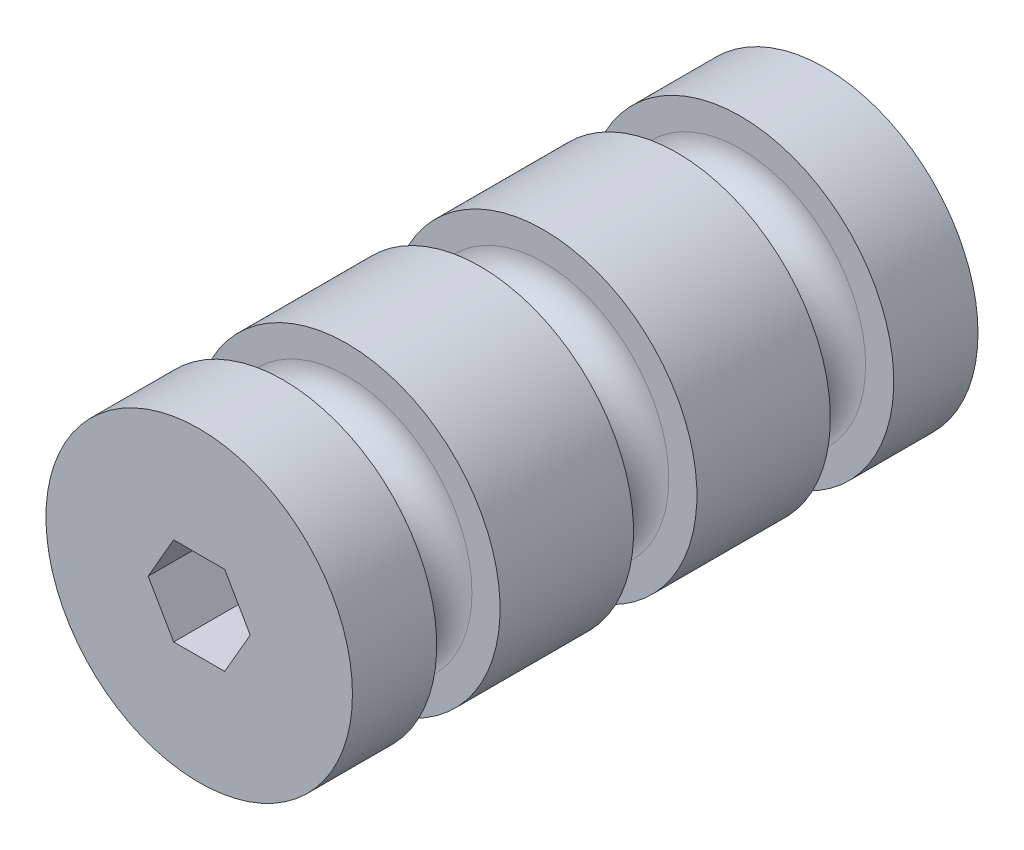
ISO-10303-21;
HEADER;
FILE_DESCRIPTION(('STEP AP214'),'2;1');
FILE_NAME('part.step','',(''),(''),'','','');
FILE_SCHEMA(('AUTOMOTIVE_DESIGN { 1 0 10303 214 1 1 1 1 }'));
ENDSEC;
DATA;
#1=APPLICATION_CONTEXT('core data for automotive mechanical design processes');
#2=APPLICATION_PROTOCOL_DEFINITION('international standard','automotive_design',2000,#1);
#3=PRODUCT_CONTEXT('',#1,'mechanical');
#4=PRODUCT('Part','Part','',(#3));
#5=PRODUCT_RELATED_PRODUCT_CATEGORY('part','',(#4));
#6=PRODUCT_DEFINITION_FORMATION('','',#4);
#7=PRODUCT_DEFINITION_CONTEXT('part definition',#1,'design');
#8=PRODUCT_DEFINITION('design','',#6,#7);
#9=PRODUCT_DEFINITION_SHAPE('','',#8);
#10=(LENGTH_UNIT() NAMED_UNIT(*) SI_UNIT(.MILLI.,.METRE.));
#11=(NAMED_UNIT(*) PLANE_ANGLE_UNIT() SI_UNIT($,.RADIAN.));
#12=(NAMED_UNIT(*) SI_UNIT($,.STERADIAN.) SOLID_ANGLE_UNIT());
#13=UNCERTAINTY_MEASURE_WITH_UNIT(LENGTH_MEASURE(1.E-05),#10,'distance_accuracy_value','');
#14=(GEOMETRIC_REPRESENTATION_CONTEXT(3) GLOBAL_UNCERTAINTY_ASSIGNED_CONTEXT((#13)) GLOBAL_UNIT_ASSIGNED_CONTEXT((#10,
#11,#12)) REPRESENTATION_CONTEXT('',''));
#15=CARTESIAN_POINT('',(0.,0.,0.));
#16=DIRECTION('',(0.,0.,1.));
#17=DIRECTION('',(1.,0.,0.));
#18=AXIS2_PLACEMENT_3D('',#15,#16,#17);
#19=CARTESIAN_POINT('',(0.,0.,95.25));
#20=DIRECTION('',(0.,0.,-1.));
#21=DIRECTION('',(-1.,0.,0.));
#22=AXIS2_PLACEMENT_3D('',#19,#20,#21);
#23=CYLINDRICAL_SURFACE('',#22,23.33625);
#24=CARTESIAN_POINT('',(0.,0.,12.827));
#25=DIRECTION('',(0.,0.,-1.));
#26=DIRECTION('',(0.,1.,0.));
#27=AXIS2_PLACEMENT_3D('',#24,#25,#26);
#28=CIRCLE('',#27,23.33625);
#29=CARTESIAN_POINT('',(0.,23.33625,12.827));
#30=VERTEX_POINT('',#29);
#31=EDGE_CURVE('E220',#30,#30,#28,.T.);
#32=ORIENTED_EDGE('',*,*,#31,.T.);
#33=EDGE_LOOP('',(#32));
#34=FACE_BOUND('',#33,.T.);
#35=CARTESIAN_POINT('',(0.,0.,0.));
#36=DIRECTION('',(0.,0.,1.));
#37=DIRECTION('',(1.,0.,0.));
#38=AXIS2_PLACEMENT_3D('',#35,#36,#37);
#39=CIRCLE('',#38,23.33625);
#40=CARTESIAN_POINT('',(23.33625,0.,0.));
#41=VERTEX_POINT('',#40);
#42=EDGE_CURVE('E43',#41,#41,#39,.T.);
#43=ORIENTED_EDGE('',*,*,#42,.T.);
#44=EDGE_LOOP('',(#43));
#45=FACE_BOUND('',#44,.T.);
#46=ADVANCED_FACE('F39',(#34,#45),#23,.T.);
#47=CARTESIAN_POINT('',(0.,0.,95.25));
#48=DIRECTION('',(0.,0.,1.));
#49=DIRECTION('',(1.,0.,0.));
#50=AXIS2_PLACEMENT_3D('',#47,#48,#49);
#51=PLANE('',#50);
#52=CARTESIAN_POINT('',(0.,0.,95.25));
#53=DIRECTION('',(0.,0.,1.));
#54=DIRECTION('',(1.,0.,0.));
#55=AXIS2_PLACEMENT_3D('',#52,#53,#54);
#56=CIRCLE('',#55,23.33625);
#57=CARTESIAN_POINT('',(23.33625,0.,95.25));
#58=VERTEX_POINT('',#57);
#59=EDGE_CURVE('E11',#58,#58,#56,.T.);
#60=ORIENTED_EDGE('',*,*,#59,.T.);
#61=EDGE_LOOP('',(#60));
#62=FACE_BOUND('',#61,.T.);
#63=DIRECTION('',(0.5,-0.866025403784439,0.));
#64=VECTOR('',#63,1.);
#65=CARTESIAN_POINT('',(-3.88614466191538,-6.73100000000001,95.25));
#66=LINE('',#65,#64);
#67=CARTESIAN_POINT('',(-7.77228932383075,0.,95.25));
#68=VERTEX_POINT('',#67);
#69=CARTESIAN_POINT('',(-3.88614466191538,-6.73100000000001,95.25));
#70=VERTEX_POINT('',#69);
#71=EDGE_CURVE('E102',#68,#70,#66,.T.);
#72=ORIENTED_EDGE('',*,*,#71,.F.);
#73=DIRECTION('',(-0.500000000000001,-0.866025403784438,0.));
#74=VECTOR('',#73,1.);
#75=CARTESIAN_POINT('',(-7.77228932383075,0.,95.25));
#76=LINE('',#75,#74);
#77=CARTESIAN_POINT('',(-3.88614466191537,6.73100000000001,95.25));
#78=VERTEX_POINT('',#77);
#79=EDGE_CURVE('E93',#78,#68,#76,.T.);
#80=ORIENTED_EDGE('',*,*,#79,.F.);
#81=DIRECTION('',(-1.,0.,0.));
#82=VECTOR('',#81,1.);
#83=CARTESIAN_POINT('',(-3.88614466191537,6.73100000000001,95.25));
#84=LINE('',#83,#82);
#85=CARTESIAN_POINT('',(3.88614466191538,6.73100000000001,95.25));
#86=VERTEX_POINT('',#85);
#87=EDGE_CURVE('E129',#86,#78,#84,.T.);
#88=ORIENTED_EDGE('',*,*,#87,.F.);
#89=DIRECTION('',(-0.5,0.866025403784439,0.));
#90=VECTOR('',#89,1.);
#91=CARTESIAN_POINT('',(3.88614466191538,6.73100000000001,95.25));
#92=LINE('',#91,#90);
#93=CARTESIAN_POINT('',(7.77228932383075,0.,95.25));
#94=VERTEX_POINT('',#93);
#95=EDGE_CURVE('E126',#94,#86,#92,.T.);
#96=ORIENTED_EDGE('',*,*,#95,.F.);
#97=DIRECTION('',(0.5,0.866025403784438,0.));
#98=VECTOR('',#97,1.);
#99=CARTESIAN_POINT('',(7.77228932383075,0.,95.25));
#100=LINE('',#99,#98);
#101=CARTESIAN_POINT('',(3.88614466191537,-6.73100000000001,95.25));
#102=VERTEX_POINT('',#101);
#103=EDGE_CURVE('E120',#102,#94,#100,.T.);
#104=ORIENTED_EDGE('',*,*,#103,.F.);
#105=DIRECTION('',(1.,0.,0.));
#106=VECTOR('',#105,1.);
#107=CARTESIAN_POINT('',(3.88614466191537,-6.73100000000001,95.25));
#108=LINE('',#107,#106);
#109=EDGE_CURVE('E116',#70,#102,#108,.T.);
#110=ORIENTED_EDGE('',*,*,#109,.F.);
#111=EDGE_LOOP('',(#72,#80,#88,#96,#104,#110));
#112=FACE_BOUND('',#111,.T.);
#113=ADVANCED_FACE('F114',(#62,#112),#51,.T.);
#114=CARTESIAN_POINT('',(0.,0.,0.));
#115=DIRECTION('',(0.,0.,1.));
#116=DIRECTION('',(1.,0.,0.));
#117=AXIS2_PLACEMENT_3D('',#114,#115,#116);
#118=PLANE('',#117);
#119=ORIENTED_EDGE('',*,*,#42,.F.);
#120=EDGE_LOOP('',(#119));
#121=FACE_BOUND('',#120,.T.);
#122=DIRECTION('',(-0.500000000000001,-0.866025403784438,0.));
#123=VECTOR('',#122,1.);
#124=CARTESIAN_POINT('',(-7.77228932383075,0.,0.));
#125=LINE('',#124,#123);
#126=CARTESIAN_POINT('',(-3.88614466191537,6.73100000000001,0.));
#127=VERTEX_POINT('',#126);
#128=CARTESIAN_POINT('',(-7.77228932383075,0.,0.));
#129=VERTEX_POINT('',#128);
#130=EDGE_CURVE('E63',#127,#129,#125,.T.);
#131=ORIENTED_EDGE('',*,*,#130,.T.);
#132=DIRECTION('',(0.5,-0.866025403784439,0.));
#133=VECTOR('',#132,1.);
#134=CARTESIAN_POINT('',(-3.88614466191538,-6.73100000000001,0.));
#135=LINE('',#134,#133);
#136=CARTESIAN_POINT('',(-3.88614466191538,-6.73100000000001,0.));
#137=VERTEX_POINT('',#136);
#138=EDGE_CURVE('E109',#129,#137,#135,.T.);
#139=ORIENTED_EDGE('',*,*,#138,.T.);
#140=DIRECTION('',(1.,0.,0.));
#141=VECTOR('',#140,1.);
#142=CARTESIAN_POINT('',(3.88614466191537,-6.73100000000001,0.));
#143=LINE('',#142,#141);
#144=CARTESIAN_POINT('',(3.88614466191537,-6.73100000000001,0.));
#145=VERTEX_POINT('',#144);
#146=EDGE_CURVE('E137',#137,#145,#143,.T.);
#147=ORIENTED_EDGE('',*,*,#146,.T.);
#148=DIRECTION('',(0.5,0.866025403784438,0.));
#149=VECTOR('',#148,1.);
#150=CARTESIAN_POINT('',(7.77228932383075,0.,0.));
#151=LINE('',#150,#149);
#152=CARTESIAN_POINT('',(7.77228932383075,0.,0.));
#153=VERTEX_POINT('',#152);
#154=EDGE_CURVE('E141',#145,#153,#151,.T.);
#155=ORIENTED_EDGE('',*,*,#154,.T.);
#156=DIRECTION('',(-0.5,0.866025403784439,0.));
#157=VECTOR('',#156,1.);
#158=CARTESIAN_POINT('',(3.88614466191538,6.73100000000001,0.));
#159=LINE('',#158,#157);
#160=CARTESIAN_POINT('',(3.88614466191538,6.73100000000001,0.));
#161=VERTEX_POINT('',#160);
#162=EDGE_CURVE('E145',#153,#161,#159,.T.);
#163=ORIENTED_EDGE('',*,*,#162,.T.);
#164=DIRECTION('',(-1.,0.,0.));
#165=VECTOR('',#164,1.);
#166=CARTESIAN_POINT('',(-3.88614466191537,6.73100000000001,0.));
#167=LINE('',#166,#165);
#168=EDGE_CURVE('E103',#161,#127,#167,.T.);
#169=ORIENTED_EDGE('',*,*,#168,.T.);
#170=EDGE_LOOP('',(#131,#139,#147,#155,#163,#169));
#171=FACE_BOUND('',#170,.T.);
#172=ADVANCED_FACE('F169',(#121,#171),#118,.F.);
#173=CARTESIAN_POINT('',(0.,0.,82.423));
#174=DIRECTION('',(0.,0.,-1.));
#175=DIRECTION('',(0.,1.,0.));
#176=AXIS2_PLACEMENT_3D('',#173,#174,#175);
#177=CIRCLE('',#176,23.33625);
#178=CARTESIAN_POINT('',(0.,23.33625,82.423));
#179=VERTEX_POINT('',#178);
#180=EDGE_CURVE('E256',#179,#179,#177,.T.);
#181=ORIENTED_EDGE('',*,*,#180,.F.);
#182=EDGE_LOOP('',(#181));
#183=FACE_BOUND('',#182,.T.);
#184=ORIENTED_EDGE('',*,*,#59,.F.);
#185=EDGE_LOOP('',(#184));
#186=FACE_BOUND('',#185,.T.);
#187=ADVANCED_FACE('F41',(#183,#186),#23,.T.);
#188=CARTESIAN_POINT('',(-7.77228932383075,0.,95.25));
#189=DIRECTION('',(0.866025403784438,-0.500000000000001,0.));
#190=DIRECTION('',(0.500000000000001,0.866025403784438,0.));
#191=AXIS2_PLACEMENT_3D('',#188,#189,#190);
#192=PLANE('',#191);
#193=ORIENTED_EDGE('',*,*,#130,.F.);
#194=DIRECTION('',(0.,0.,-1.));
#195=VECTOR('',#194,1.);
#196=CARTESIAN_POINT('',(-3.88614466191537,6.73100000000001,95.25));
#197=LINE('',#196,#195);
#198=EDGE_CURVE('E97',#78,#127,#197,.T.);
#199=ORIENTED_EDGE('',*,*,#198,.F.);
#200=ORIENTED_EDGE('',*,*,#79,.T.);
#201=DIRECTION('',(0.,0.,-1.));
#202=VECTOR('',#201,1.);
#203=CARTESIAN_POINT('',(-7.77228932383075,0.,95.25));
#204=LINE('',#203,#202);
#205=EDGE_CURVE('E96',#68,#129,#204,.T.);
#206=ORIENTED_EDGE('',*,*,#205,.T.);
#207=EDGE_LOOP('',(#193,#199,#200,#206));
#208=FACE_BOUND('',#207,.T.);
#209=ADVANCED_FACE('F95',(#208),#192,.T.);
#210=CARTESIAN_POINT('',(-3.88614466191538,-6.73100000000001,95.25));
#211=DIRECTION('',(0.866025403784439,0.5,0.));
#212=DIRECTION('',(-0.5,0.866025403784439,0.));
#213=AXIS2_PLACEMENT_3D('',#210,#211,#212);
#214=PLANE('',#213);
#215=ORIENTED_EDGE('',*,*,#138,.F.);
#216=ORIENTED_EDGE('',*,*,#205,.F.);
#217=ORIENTED_EDGE('',*,*,#71,.T.);
#218=DIRECTION('',(0.,0.,-1.));
#219=VECTOR('',#218,1.);
#220=CARTESIAN_POINT('',(-3.88614466191538,-6.73100000000001,95.25));
#221=LINE('',#220,#219);
#222=EDGE_CURVE('E111',#70,#137,#221,.T.);
#223=ORIENTED_EDGE('',*,*,#222,.T.);
#224=EDGE_LOOP('',(#215,#216,#217,#223));
#225=FACE_BOUND('',#224,.T.);
#226=ADVANCED_FACE('F106',(#225),#214,.T.);
#227=CARTESIAN_POINT('',(3.88614466191537,-6.73100000000001,95.25));
#228=DIRECTION('',(0.,1.,0.));
#229=DIRECTION('',(0.,0.,1.));
#230=AXIS2_PLACEMENT_3D('',#227,#228,#229);
#231=PLANE('',#230);
#232=ORIENTED_EDGE('',*,*,#146,.F.);
#233=ORIENTED_EDGE('',*,*,#222,.F.);
#234=ORIENTED_EDGE('',*,*,#109,.T.);
#235=DIRECTION('',(0.,0.,-1.));
#236=VECTOR('',#235,1.);
#237=CARTESIAN_POINT('',(3.88614466191537,-6.73100000000001,95.25));
#238=LINE('',#237,#236);
#239=EDGE_CURVE('E159',#102,#145,#238,.T.);
#240=ORIENTED_EDGE('',*,*,#239,.T.);
#241=EDGE_LOOP('',(#232,#233,#234,#240));
#242=FACE_BOUND('',#241,.T.);
#243=ADVANCED_FACE('F165',(#242),#231,.T.);
#244=CARTESIAN_POINT('',(7.77228932383075,0.,95.25));
#245=DIRECTION('',(-0.866025403784438,0.5,0.));
#246=DIRECTION('',(-0.5,-0.866025403784438,0.));
#247=AXIS2_PLACEMENT_3D('',#244,#245,#246);
#248=PLANE('',#247);
#249=ORIENTED_EDGE('',*,*,#154,.F.);
#250=ORIENTED_EDGE('',*,*,#239,.F.);
#251=ORIENTED_EDGE('',*,*,#103,.T.);
#252=DIRECTION('',(0.,0.,-1.));
#253=VECTOR('',#252,1.);
#254=CARTESIAN_POINT('',(7.77228932383075,0.,95.25));
#255=LINE('',#254,#253);
#256=EDGE_CURVE('E156',#94,#153,#255,.T.);
#257=ORIENTED_EDGE('',*,*,#256,.T.);
#258=EDGE_LOOP('',(#249,#250,#251,#257));
#259=FACE_BOUND('',#258,.T.);
#260=ADVANCED_FACE('F177',(#259),#248,.T.);
#261=CARTESIAN_POINT('',(3.88614466191538,6.73100000000001,95.25));
#262=DIRECTION('',(-0.866025403784439,-0.5,0.));
#263=DIRECTION('',(0.5,-0.866025403784439,0.));
#264=AXIS2_PLACEMENT_3D('',#261,#262,#263);
#265=PLANE('',#264);
#266=ORIENTED_EDGE('',*,*,#162,.F.);
#267=ORIENTED_EDGE('',*,*,#256,.F.);
#268=ORIENTED_EDGE('',*,*,#95,.T.);
#269=DIRECTION('',(0.,0.,-1.));
#270=VECTOR('',#269,1.);
#271=CARTESIAN_POINT('',(3.88614466191538,6.73100000000001,95.25));
#272=LINE('',#271,#270);
#273=EDGE_CURVE('E55',#86,#161,#272,.T.);
#274=ORIENTED_EDGE('',*,*,#273,.T.);
#275=EDGE_LOOP('',(#266,#267,#268,#274));
#276=FACE_BOUND('',#275,.T.);
#277=ADVANCED_FACE('F175',(#276),#265,.T.);
#278=CARTESIAN_POINT('',(-3.88614466191537,6.73100000000001,95.25));
#279=DIRECTION('',(0.,-1.,0.));
#280=DIRECTION('',(0.,0.,-1.));
#281=AXIS2_PLACEMENT_3D('',#278,#279,#280);
#282=PLANE('',#281);
#283=ORIENTED_EDGE('',*,*,#168,.F.);
#284=ORIENTED_EDGE('',*,*,#273,.F.);
#285=ORIENTED_EDGE('',*,*,#87,.T.);
#286=ORIENTED_EDGE('',*,*,#198,.T.);
#287=EDGE_LOOP('',(#283,#284,#285,#286));
#288=FACE_BOUND('',#287,.T.);
#289=ADVANCED_FACE('F171',(#288),#282,.T.);
#290=CARTESIAN_POINT('',(0.,0.,17.653));
#291=DIRECTION('',(0.,0.,-1.));
#292=DIRECTION('',(0.,1.,0.));
#293=AXIS2_PLACEMENT_3D('',#290,#291,#292);
#294=TOROIDAL_SURFACE('',#293,19.05,4.826);
#295=CARTESIAN_POINT('',(0.,0.,12.827));
#296=DIRECTION('',(0.,0.,-1.));
#297=DIRECTION('',(0.,1.,0.));
#298=AXIS2_PLACEMENT_3D('',#295,#296,#297);
#299=CIRCLE('',#298,19.05);
#300=CARTESIAN_POINT('',(0.,19.05,12.827));
#301=VERTEX_POINT('',#300);
#302=EDGE_CURVE('E225',#301,#301,#299,.T.);
#303=ORIENTED_EDGE('',*,*,#302,.F.);
#304=EDGE_LOOP('',(#303));
#305=FACE_BOUND('',#304,.T.);
#306=CARTESIAN_POINT('',(0.,0.,22.479));
#307=DIRECTION('',(0.,0.,-1.));
#308=DIRECTION('',(0.,1.,0.));
#309=AXIS2_PLACEMENT_3D('',#306,#307,#308);
#310=CIRCLE('',#309,19.05);
#311=CARTESIAN_POINT('',(0.,19.05,22.479));
#312=VERTEX_POINT('',#311);
#313=EDGE_CURVE('E221',#312,#312,#310,.T.);
#314=ORIENTED_EDGE('',*,*,#313,.T.);
#315=EDGE_LOOP('',(#314));
#316=FACE_BOUND('',#315,.T.);
#317=ADVANCED_FACE('F299',(#305,#316),#294,.F.);
#318=CARTESIAN_POINT('',(0.,19.05,12.827));
#319=DIRECTION('',(0.,0.,-1.));
#320=DIRECTION('',(0.,1.,0.));
#321=AXIS2_PLACEMENT_3D('',#318,#319,#320);
#322=PLANE('',#321);
#323=ORIENTED_EDGE('',*,*,#31,.F.);
#324=EDGE_LOOP('',(#323));
#325=FACE_BOUND('',#324,.T.);
#326=ORIENTED_EDGE('',*,*,#302,.T.);
#327=EDGE_LOOP('',(#326));
#328=FACE_BOUND('',#327,.T.);
#329=ADVANCED_FACE('F282',(#325,#328),#322,.F.);
#330=CARTESIAN_POINT('',(0.,19.05,22.479));
#331=DIRECTION('',(0.,0.,1.));
#332=DIRECTION('',(0.,-1.,0.));
#333=AXIS2_PLACEMENT_3D('',#330,#331,#332);
#334=PLANE('',#333);
#335=ORIENTED_EDGE('',*,*,#313,.F.);
#336=EDGE_LOOP('',(#335));
#337=FACE_BOUND('',#336,.T.);
#338=CARTESIAN_POINT('',(0.,0.,22.479));
#339=DIRECTION('',(0.,0.,-1.));
#340=DIRECTION('',(0.,1.,0.));
#341=AXIS2_PLACEMENT_3D('',#338,#339,#340);
#342=CIRCLE('',#341,23.33625);
#343=CARTESIAN_POINT('',(0.,23.33625,22.479));
#344=VERTEX_POINT('',#343);
#345=EDGE_CURVE('E217',#344,#344,#342,.T.);
#346=ORIENTED_EDGE('',*,*,#345,.T.);
#347=EDGE_LOOP('',(#346));
#348=FACE_BOUND('',#347,.T.);
#349=ADVANCED_FACE('F274',(#337,#348),#334,.F.);
#350=CARTESIAN_POINT('',(0.,0.,77.597));
#351=DIRECTION('',(0.,0.,-1.));
#352=DIRECTION('',(0.,1.,0.));
#353=AXIS2_PLACEMENT_3D('',#350,#351,#352);
#354=TOROIDAL_SURFACE('',#353,19.05,4.826);
#355=CARTESIAN_POINT('',(0.,0.,72.771));
#356=DIRECTION('',(0.,0.,-1.));
#357=DIRECTION('',(0.,1.,0.));
#358=AXIS2_PLACEMENT_3D('',#355,#356,#357);
#359=CIRCLE('',#358,19.05);
#360=CARTESIAN_POINT('',(0.,19.05,72.771));
#361=VERTEX_POINT('',#360);
#362=EDGE_CURVE('E134',#361,#361,#359,.T.);
#363=ORIENTED_EDGE('',*,*,#362,.F.);
#364=EDGE_LOOP('',(#363));
#365=FACE_BOUND('',#364,.T.);
#366=CARTESIAN_POINT('',(0.,0.,82.423));
#367=DIRECTION('',(0.,0.,-1.));
#368=DIRECTION('',(0.,1.,0.));
#369=AXIS2_PLACEMENT_3D('',#366,#367,#368);
#370=CIRCLE('',#369,19.05);
#371=CARTESIAN_POINT('',(0.,19.05,82.423));
#372=VERTEX_POINT('',#371);
#373=EDGE_CURVE('E251',#372,#372,#370,.T.);
#374=ORIENTED_EDGE('',*,*,#373,.T.);
#375=EDGE_LOOP('',(#374));
#376=FACE_BOUND('',#375,.T.);
#377=ADVANCED_FACE('F272',(#365,#376),#354,.F.);
#378=CARTESIAN_POINT('',(0.,19.05,72.771));
#379=DIRECTION('',(0.,0.,-1.));
#380=DIRECTION('',(0.,1.,0.));
#381=AXIS2_PLACEMENT_3D('',#378,#379,#380);
#382=PLANE('',#381);
#383=CARTESIAN_POINT('',(0.,0.,72.771));
#384=DIRECTION('',(0.,0.,-1.));
#385=DIRECTION('',(0.,1.,0.));
#386=AXIS2_PLACEMENT_3D('',#383,#384,#385);
#387=CIRCLE('',#386,23.33625);
#388=CARTESIAN_POINT('',(0.,23.33625,72.771));
#389=VERTEX_POINT('',#388);
#390=EDGE_CURVE('E262',#389,#389,#387,.T.);
#391=ORIENTED_EDGE('',*,*,#390,.F.);
#392=EDGE_LOOP('',(#391));
#393=FACE_BOUND('',#392,.T.);
#394=ORIENTED_EDGE('',*,*,#362,.T.);
#395=EDGE_LOOP('',(#394));
#396=FACE_BOUND('',#395,.T.);
#397=ADVANCED_FACE('F208',(#393,#396),#382,.F.);
#398=CARTESIAN_POINT('',(0.,19.05,82.423));
#399=DIRECTION('',(0.,0.,1.));
#400=DIRECTION('',(0.,-1.,0.));
#401=AXIS2_PLACEMENT_3D('',#398,#399,#400);
#402=PLANE('',#401);
#403=ORIENTED_EDGE('',*,*,#373,.F.);
#404=EDGE_LOOP('',(#403));
#405=FACE_BOUND('',#404,.T.);
#406=ORIENTED_EDGE('',*,*,#180,.T.);
#407=EDGE_LOOP('',(#406));
#408=FACE_BOUND('',#407,.T.);
#409=ADVANCED_FACE('F200',(#405,#408),#402,.F.);
#410=CARTESIAN_POINT('',(0.,0.,42.799));
#411=DIRECTION('',(0.,0.,-1.));
#412=DIRECTION('',(0.,1.,0.));
#413=AXIS2_PLACEMENT_3D('',#410,#411,#412);
#414=CIRCLE('',#413,23.33625);
#415=CARTESIAN_POINT('',(0.,23.33625,42.799));
#416=VERTEX_POINT('',#415);
#417=EDGE_CURVE('E214',#416,#416,#414,.T.);
#418=ORIENTED_EDGE('',*,*,#417,.T.);
#419=EDGE_LOOP('',(#418));
#420=FACE_BOUND('',#419,.T.);
#421=ORIENTED_EDGE('',*,*,#345,.F.);
#422=EDGE_LOOP('',(#421));
#423=FACE_BOUND('',#422,.T.);
#424=ADVANCED_FACE('F188',(#420,#423),#23,.T.);
#425=ORIENTED_EDGE('',*,*,#390,.T.);
#426=EDGE_LOOP('',(#425));
#427=FACE_BOUND('',#426,.T.);
#428=CARTESIAN_POINT('',(0.,0.,52.451));
#429=DIRECTION('',(0.,0.,-1.));
#430=DIRECTION('',(0.,1.,0.));
#431=AXIS2_PLACEMENT_3D('',#428,#429,#430);
#432=CIRCLE('',#431,23.33625);
#433=CARTESIAN_POINT('',(0.,23.33625,52.451));
#434=VERTEX_POINT('',#433);
#435=EDGE_CURVE('E237',#434,#434,#432,.T.);
#436=ORIENTED_EDGE('',*,*,#435,.F.);
#437=EDGE_LOOP('',(#436));
#438=FACE_BOUND('',#437,.T.);
#439=ADVANCED_FACE('F198',(#427,#438),#23,.T.);
#440=CARTESIAN_POINT('',(0.,0.,47.625));
#441=DIRECTION('',(0.,0.,-1.));
#442=DIRECTION('',(0.,1.,0.));
#443=AXIS2_PLACEMENT_3D('',#440,#441,#442);
#444=TOROIDAL_SURFACE('',#443,19.05,4.826);
#445=CARTESIAN_POINT('',(0.,0.,42.799));
#446=DIRECTION('',(0.,0.,-1.));
#447=DIRECTION('',(0.,1.,0.));
#448=AXIS2_PLACEMENT_3D('',#445,#446,#447);
#449=CIRCLE('',#448,19.05);
#450=CARTESIAN_POINT('',(0.,19.05,42.799));
#451=VERTEX_POINT('',#450);
#452=EDGE_CURVE('E248',#451,#451,#449,.T.);
#453=ORIENTED_EDGE('',*,*,#452,.F.);
#454=EDGE_LOOP('',(#453));
#455=FACE_BOUND('',#454,.T.);
#456=CARTESIAN_POINT('',(0.,0.,52.451));
#457=DIRECTION('',(0.,0.,-1.));
#458=DIRECTION('',(0.,1.,0.));
#459=AXIS2_PLACEMENT_3D('',#456,#457,#458);
#460=CIRCLE('',#459,19.05);
#461=CARTESIAN_POINT('',(0.,19.05,52.451));
#462=VERTEX_POINT('',#461);
#463=EDGE_CURVE('E232',#462,#462,#460,.T.);
#464=ORIENTED_EDGE('',*,*,#463,.T.);
#465=EDGE_LOOP('',(#464));
#466=FACE_BOUND('',#465,.T.);
#467=ADVANCED_FACE('F206',(#455,#466),#444,.F.);
#468=CARTESIAN_POINT('',(0.,19.05,42.799));
#469=DIRECTION('',(0.,0.,-1.));
#470=DIRECTION('',(0.,1.,0.));
#471=AXIS2_PLACEMENT_3D('',#468,#469,#470);
#472=PLANE('',#471);
#473=ORIENTED_EDGE('',*,*,#417,.F.);
#474=EDGE_LOOP('',(#473));
#475=FACE_BOUND('',#474,.T.);
#476=ORIENTED_EDGE('',*,*,#452,.T.);
#477=EDGE_LOOP('',(#476));
#478=FACE_BOUND('',#477,.T.);
#479=ADVANCED_FACE('F289',(#475,#478),#472,.F.);
#480=CARTESIAN_POINT('',(0.,19.05,52.451));
#481=DIRECTION('',(0.,0.,1.));
#482=DIRECTION('',(0.,-1.,0.));
#483=AXIS2_PLACEMENT_3D('',#480,#481,#482);
#484=PLANE('',#483);
#485=ORIENTED_EDGE('',*,*,#463,.F.);
#486=EDGE_LOOP('',(#485));
#487=FACE_BOUND('',#486,.T.);
#488=ORIENTED_EDGE('',*,*,#435,.T.);
#489=EDGE_LOOP('',(#488));
#490=FACE_BOUND('',#489,.T.);
#491=ADVANCED_FACE('F286',(#487,#490),#484,.F.);
#492=CLOSED_SHELL('',(#46,#113,#172,#187,#209,#226,#243,#260,#277,#289,#317,#329,#349,#377,#397,
#409,#424,#439,#467,#479,#491));
#493=MANIFOLD_SOLID_BREP('B2',#492);
#494=ADVANCED_BREP_SHAPE_REPRESENTATION('',(#18,#493),#14);
#495=SHAPE_DEFINITION_REPRESENTATION(#9,#494);
ENDSEC;
END-ISO-10303-21;
